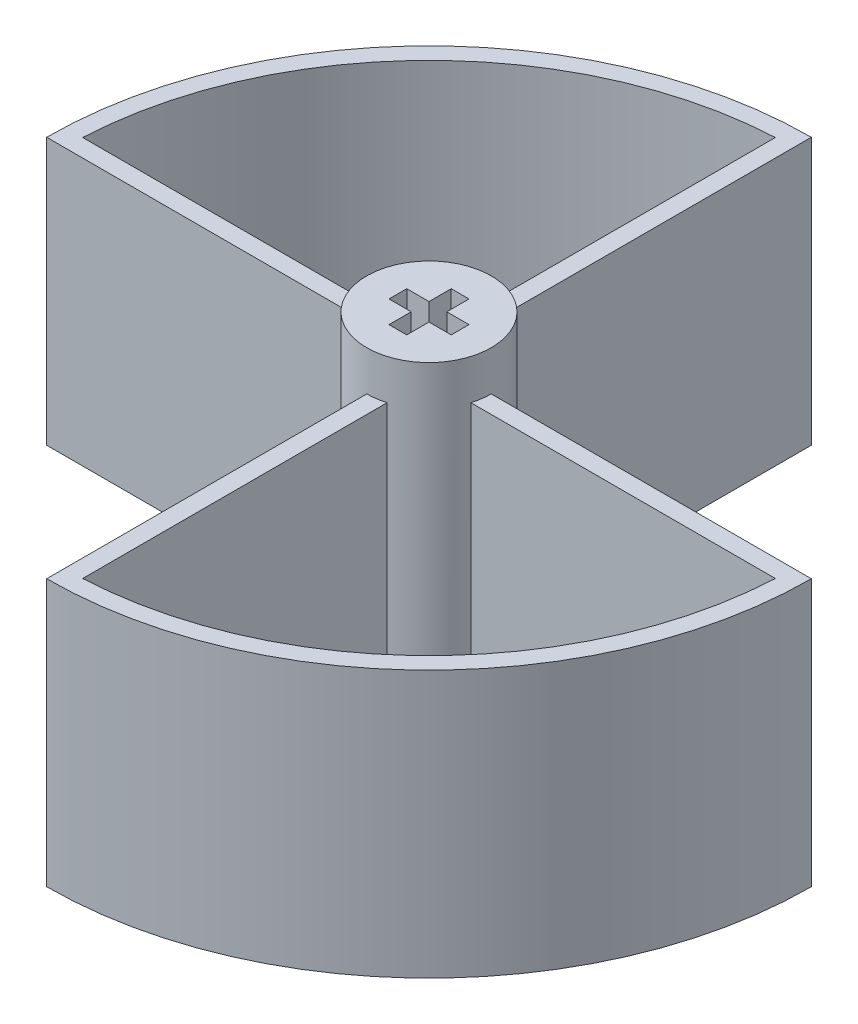
ISO-10303-21;
HEADER;
FILE_DESCRIPTION(('STEP AP214'),'2;1');
FILE_NAME('part.step','',(''),(''),'','','');
FILE_SCHEMA(('AUTOMOTIVE_DESIGN { 1 0 10303 214 1 1 1 1 }'));
ENDSEC;
DATA;
#1=APPLICATION_CONTEXT('core data for automotive mechanical design processes');
#2=APPLICATION_PROTOCOL_DEFINITION('international standard','automotive_design',2000,#1);
#3=PRODUCT_CONTEXT('',#1,'mechanical');
#4=PRODUCT('Part','Part','',(#3));
#5=PRODUCT_RELATED_PRODUCT_CATEGORY('part','',(#4));
#6=PRODUCT_DEFINITION_FORMATION('','',#4);
#7=PRODUCT_DEFINITION_CONTEXT('part definition',#1,'design');
#8=PRODUCT_DEFINITION('design','',#6,#7);
#9=PRODUCT_DEFINITION_SHAPE('','',#8);
#10=(LENGTH_UNIT() NAMED_UNIT(*) SI_UNIT(.MILLI.,.METRE.));
#11=(NAMED_UNIT(*) PLANE_ANGLE_UNIT() SI_UNIT($,.RADIAN.));
#12=(NAMED_UNIT(*) SI_UNIT($,.STERADIAN.) SOLID_ANGLE_UNIT());
#13=UNCERTAINTY_MEASURE_WITH_UNIT(LENGTH_MEASURE(1.E-05),#10,'distance_accuracy_value','');
#14=(GEOMETRIC_REPRESENTATION_CONTEXT(3) GLOBAL_UNCERTAINTY_ASSIGNED_CONTEXT((#13)) GLOBAL_UNIT_ASSIGNED_CONTEXT((#10,
#11,#12)) REPRESENTATION_CONTEXT('',''));
#15=CARTESIAN_POINT('',(0.,0.,0.));
#16=DIRECTION('',(0.,0.,1.));
#17=DIRECTION('',(1.,0.,0.));
#18=AXIS2_PLACEMENT_3D('',#15,#16,#17);
#19=CARTESIAN_POINT('',(0.,-4.5,0.));
#20=DIRECTION('',(0.,1.,0.));
#21=DIRECTION('',(0.,0.,1.));
#22=AXIS2_PLACEMENT_3D('',#19,#20,#21);
#23=PLANE('',#22);
#24=DIRECTION('',(-1.,0.,0.));
#25=VECTOR('',#24,1.);
#26=CARTESIAN_POINT('',(-3.5,-4.5,-1.));
#27=LINE('',#26,#25);
#28=CARTESIAN_POINT('',(-1.,-4.5,-1.));
#29=VERTEX_POINT('',#28);
#30=CARTESIAN_POINT('',(-3.5,-4.5,-1.));
#31=VERTEX_POINT('',#30);
#32=EDGE_CURVE('E339',#29,#31,#27,.T.);
#33=ORIENTED_EDGE('',*,*,#32,.T.);
#34=DIRECTION('',(0.,0.,1.));
#35=VECTOR('',#34,1.);
#36=CARTESIAN_POINT('',(-3.5,-4.5,1.));
#37=LINE('',#36,#35);
#38=CARTESIAN_POINT('',(-3.5,-4.5,1.));
#39=VERTEX_POINT('',#38);
#40=EDGE_CURVE('E298',#31,#39,#37,.T.);
#41=ORIENTED_EDGE('',*,*,#40,.T.);
#42=DIRECTION('',(1.,0.,0.));
#43=VECTOR('',#42,1.);
#44=CARTESIAN_POINT('',(-1.,-4.5,1.));
#45=LINE('',#44,#43);
#46=CARTESIAN_POINT('',(-1.,-4.5,1.));
#47=VERTEX_POINT('',#46);
#48=EDGE_CURVE('E234',#39,#47,#45,.T.);
#49=ORIENTED_EDGE('',*,*,#48,.T.);
#50=DIRECTION('',(0.,0.,1.));
#51=VECTOR('',#50,1.);
#52=CARTESIAN_POINT('',(-1.,-4.5,3.5));
#53=LINE('',#52,#51);
#54=CARTESIAN_POINT('',(-1.,-4.5,3.5));
#55=VERTEX_POINT('',#54);
#56=EDGE_CURVE('E303',#47,#55,#53,.T.);
#57=ORIENTED_EDGE('',*,*,#56,.T.);
#58=DIRECTION('',(1.,0.,0.));
#59=VECTOR('',#58,1.);
#60=CARTESIAN_POINT('',(1.,-4.5,3.5));
#61=LINE('',#60,#59);
#62=CARTESIAN_POINT('',(1.,-4.5,3.5));
#63=VERTEX_POINT('',#62);
#64=EDGE_CURVE('E307',#55,#63,#61,.T.);
#65=ORIENTED_EDGE('',*,*,#64,.T.);
#66=DIRECTION('',(0.,0.,-1.));
#67=VECTOR('',#66,1.);
#68=CARTESIAN_POINT('',(1.,-4.5,1.));
#69=LINE('',#68,#67);
#70=CARTESIAN_POINT('',(1.,-4.5,1.));
#71=VERTEX_POINT('',#70);
#72=EDGE_CURVE('E311',#63,#71,#69,.T.);
#73=ORIENTED_EDGE('',*,*,#72,.T.);
#74=DIRECTION('',(1.,0.,0.));
#75=VECTOR('',#74,1.);
#76=CARTESIAN_POINT('',(3.5,-4.5,1.));
#77=LINE('',#76,#75);
#78=CARTESIAN_POINT('',(3.5,-4.5,1.));
#79=VERTEX_POINT('',#78);
#80=EDGE_CURVE('E315',#71,#79,#77,.T.);
#81=ORIENTED_EDGE('',*,*,#80,.T.);
#82=DIRECTION('',(0.,0.,-1.));
#83=VECTOR('',#82,1.);
#84=CARTESIAN_POINT('',(3.5,-4.5,-1.));
#85=LINE('',#84,#83);
#86=CARTESIAN_POINT('',(3.5,-4.5,-1.));
#87=VERTEX_POINT('',#86);
#88=EDGE_CURVE('E319',#79,#87,#85,.T.);
#89=ORIENTED_EDGE('',*,*,#88,.T.);
#90=DIRECTION('',(-1.,0.,0.));
#91=VECTOR('',#90,1.);
#92=CARTESIAN_POINT('',(1.,-4.5,-1.));
#93=LINE('',#92,#91);
#94=CARTESIAN_POINT('',(1.,-4.5,-1.));
#95=VERTEX_POINT('',#94);
#96=EDGE_CURVE('E323',#87,#95,#93,.T.);
#97=ORIENTED_EDGE('',*,*,#96,.T.);
#98=DIRECTION('',(0.,0.,-1.));
#99=VECTOR('',#98,1.);
#100=CARTESIAN_POINT('',(0.999999999999999,-4.5,-3.5));
#101=LINE('',#100,#99);
#102=CARTESIAN_POINT('',(0.999999999999999,-4.5,-3.5));
#103=VERTEX_POINT('',#102);
#104=EDGE_CURVE('E327',#95,#103,#101,.T.);
#105=ORIENTED_EDGE('',*,*,#104,.T.);
#106=DIRECTION('',(-1.,0.,0.));
#107=VECTOR('',#106,1.);
#108=CARTESIAN_POINT('',(-1.,-4.5,-3.5));
#109=LINE('',#108,#107);
#110=CARTESIAN_POINT('',(-1.,-4.5,-3.5));
#111=VERTEX_POINT('',#110);
#112=EDGE_CURVE('E331',#103,#111,#109,.T.);
#113=ORIENTED_EDGE('',*,*,#112,.T.);
#114=DIRECTION('',(0.,0.,1.));
#115=VECTOR('',#114,1.);
#116=CARTESIAN_POINT('',(-1.,-4.5,-1.));
#117=LINE('',#116,#115);
#118=EDGE_CURVE('E335',#111,#29,#117,.T.);
#119=ORIENTED_EDGE('',*,*,#118,.T.);
#120=EDGE_LOOP('',(#33,#41,#49,#57,#65,#73,#81,#89,#97,#105,#113,#119));
#121=FACE_BOUND('',#120,.T.);
#122=CARTESIAN_POINT('',(0.,-4.5,0.));
#123=DIRECTION('',(0.,1.,0.));
#124=DIRECTION('',(0.,0.,1.));
#125=AXIS2_PLACEMENT_3D('',#122,#123,#124);
#126=CIRCLE('',#125,7.);
#127=CARTESIAN_POINT('',(0.,-4.5,7.));
#128=VERTEX_POINT('',#127);
#129=EDGE_CURVE('E343',#128,#128,#126,.T.);
#130=ORIENTED_EDGE('',*,*,#129,.F.);
#131=EDGE_LOOP('',(#130));
#132=FACE_BOUND('',#131,.T.);
#133=ADVANCED_FACE('F39',(#121,#132),#23,.F.);
#134=CARTESIAN_POINT('',(0.,30.,0.));
#135=DIRECTION('',(0.,-1.,0.));
#136=DIRECTION('',(0.,0.,-1.));
#137=AXIS2_PLACEMENT_3D('',#134,#135,#136);
#138=CYLINDRICAL_SURFACE('',#137,43.);
#139=CARTESIAN_POINT('',(0.,0.,0.));
#140=DIRECTION('',(0.,1.,0.));
#141=DIRECTION('',(0.,0.,1.));
#142=AXIS2_PLACEMENT_3D('',#139,#140,#141);
#143=CIRCLE('',#142,43.);
#144=CARTESIAN_POINT('',(4.50401092710764E-13,0.,43.));
#145=VERTEX_POINT('',#144);
#146=CARTESIAN_POINT('',(43.,0.,0.));
#147=VERTEX_POINT('',#146);
#148=EDGE_CURVE('E436',#145,#147,#143,.T.);
#149=ORIENTED_EDGE('',*,*,#148,.T.);
#150=DIRECTION('',(0.,-1.,0.));
#151=VECTOR('',#150,1.);
#152=CARTESIAN_POINT('',(43.,30.,0.));
#153=LINE('',#152,#151);
#154=CARTESIAN_POINT('',(43.,30.,0.));
#155=VERTEX_POINT('',#154);
#156=EDGE_CURVE('E48',#155,#147,#153,.T.);
#157=ORIENTED_EDGE('',*,*,#156,.F.);
#158=CARTESIAN_POINT('',(0.,30.,0.));
#159=DIRECTION('',(0.,1.,0.));
#160=DIRECTION('',(0.,0.,1.));
#161=AXIS2_PLACEMENT_3D('',#158,#159,#160);
#162=CIRCLE('',#161,43.);
#163=CARTESIAN_POINT('',(4.50401092710764E-13,30.,43.));
#164=VERTEX_POINT('',#163);
#165=EDGE_CURVE('E464',#164,#155,#162,.T.);
#166=ORIENTED_EDGE('',*,*,#165,.F.);
#167=DIRECTION('',(0.,-1.,0.));
#168=VECTOR('',#167,1.);
#169=CARTESIAN_POINT('',(4.50401092710764E-13,30.,43.));
#170=LINE('',#169,#168);
#171=EDGE_CURVE('E484',#164,#145,#170,.T.);
#172=ORIENTED_EDGE('',*,*,#171,.T.);
#173=EDGE_LOOP('',(#149,#157,#166,#172));
#174=FACE_BOUND('',#173,.T.);
#175=ADVANCED_FACE('F41',(#174),#138,.T.);
#176=CARTESIAN_POINT('',(7.,30.,0.));
#177=DIRECTION('',(0.,0.,1.));
#178=DIRECTION('',(1.,0.,0.));
#179=AXIS2_PLACEMENT_3D('',#176,#177,#178);
#180=PLANE('',#179);
#181=DIRECTION('',(-1.,0.,0.));
#182=VECTOR('',#181,1.);
#183=CARTESIAN_POINT('',(7.,0.,0.));
#184=LINE('',#183,#182);
#185=CARTESIAN_POINT('',(7.,0.,0.));
#186=VERTEX_POINT('',#185);
#187=EDGE_CURVE('E488',#147,#186,#184,.T.);
#188=ORIENTED_EDGE('',*,*,#187,.T.);
#189=DIRECTION('',(0.,-1.,0.));
#190=VECTOR('',#189,1.);
#191=CARTESIAN_POINT('',(7.,30.,0.));
#192=LINE('',#191,#190);
#193=CARTESIAN_POINT('',(7.,30.,0.));
#194=VERTEX_POINT('',#193);
#195=EDGE_CURVE('E527',#194,#186,#192,.T.);
#196=ORIENTED_EDGE('',*,*,#195,.F.);
#197=DIRECTION('',(-1.,0.,0.));
#198=VECTOR('',#197,1.);
#199=CARTESIAN_POINT('',(7.,30.,0.));
#200=LINE('',#199,#198);
#201=EDGE_CURVE('E468',#155,#194,#200,.T.);
#202=ORIENTED_EDGE('',*,*,#201,.F.);
#203=ORIENTED_EDGE('',*,*,#156,.T.);
#204=EDGE_LOOP('',(#188,#196,#202,#203));
#205=FACE_BOUND('',#204,.T.);
#206=ADVANCED_FACE('F534',(#205),#180,.F.);
#207=CARTESIAN_POINT('',(0.,30.,0.));
#208=DIRECTION('',(0.,-1.,0.));
#209=DIRECTION('',(0.,0.,-1.));
#210=AXIS2_PLACEMENT_3D('',#207,#208,#209);
#211=CYLINDRICAL_SURFACE('',#210,43.);
#212=CARTESIAN_POINT('',(0.,0.,0.));
#213=DIRECTION('',(0.,1.,0.));
#214=DIRECTION('',(0.,0.,1.));
#215=AXIS2_PLACEMENT_3D('',#212,#213,#214);
#216=CIRCLE('',#215,43.);
#217=CARTESIAN_POINT('',(0.,0.,-43.));
#218=VERTEX_POINT('',#217);
#219=CARTESIAN_POINT('',(-43.,0.,3.00267395140509E-13));
#220=VERTEX_POINT('',#219);
#221=EDGE_CURVE('E495',#218,#220,#216,.T.);
#222=ORIENTED_EDGE('',*,*,#221,.T.);
#223=DIRECTION('',(0.,-1.,0.));
#224=VECTOR('',#223,1.);
#225=CARTESIAN_POINT('',(-43.,30.,3.00267395140509E-13));
#226=LINE('',#225,#224);
#227=CARTESIAN_POINT('',(-43.,30.,3.00267395140509E-13));
#228=VERTEX_POINT('',#227);
#229=EDGE_CURVE('E515',#228,#220,#226,.T.);
#230=ORIENTED_EDGE('',*,*,#229,.F.);
#231=CARTESIAN_POINT('',(0.,30.,0.));
#232=DIRECTION('',(0.,1.,0.));
#233=DIRECTION('',(0.,0.,1.));
#234=AXIS2_PLACEMENT_3D('',#231,#232,#233);
#235=CIRCLE('',#234,43.);
#236=CARTESIAN_POINT('',(0.,30.,-43.));
#237=VERTEX_POINT('',#236);
#238=EDGE_CURVE('E475',#237,#228,#235,.T.);
#239=ORIENTED_EDGE('',*,*,#238,.F.);
#240=DIRECTION('',(0.,-1.,0.));
#241=VECTOR('',#240,1.);
#242=CARTESIAN_POINT('',(0.,30.,-43.));
#243=LINE('',#242,#241);
#244=EDGE_CURVE('E519',#237,#218,#243,.T.);
#245=ORIENTED_EDGE('',*,*,#244,.T.);
#246=EDGE_LOOP('',(#222,#230,#239,#245));
#247=FACE_BOUND('',#246,.T.);
#248=ADVANCED_FACE('F627',(#247),#211,.T.);
#249=CARTESIAN_POINT('',(0.,30.,-7.));
#250=DIRECTION('',(-1.,0.,0.));
#251=DIRECTION('',(0.,0.,1.));
#252=AXIS2_PLACEMENT_3D('',#249,#250,#251);
#253=PLANE('',#252);
#254=DIRECTION('',(0.,0.,-1.));
#255=VECTOR('',#254,1.);
#256=CARTESIAN_POINT('',(0.,0.,-7.));
#257=LINE('',#256,#255);
#258=CARTESIAN_POINT('',(0.,0.,-7.));
#259=VERTEX_POINT('',#258);
#260=EDGE_CURVE('E492',#259,#218,#257,.T.);
#261=ORIENTED_EDGE('',*,*,#260,.T.);
#262=ORIENTED_EDGE('',*,*,#244,.F.);
#263=DIRECTION('',(0.,0.,-1.));
#264=VECTOR('',#263,1.);
#265=CARTESIAN_POINT('',(0.,30.,-7.));
#266=LINE('',#265,#264);
#267=CARTESIAN_POINT('',(0.,30.,-7.));
#268=VERTEX_POINT('',#267);
#269=EDGE_CURVE('E472',#268,#237,#266,.T.);
#270=ORIENTED_EDGE('',*,*,#269,.F.);
#271=DIRECTION('',(0.,-1.,0.));
#272=VECTOR('',#271,1.);
#273=CARTESIAN_POINT('',(0.,30.,-7.));
#274=LINE('',#273,#272);
#275=EDGE_CURVE('E523',#268,#259,#274,.T.);
#276=ORIENTED_EDGE('',*,*,#275,.T.);
#277=EDGE_LOOP('',(#261,#262,#270,#276));
#278=FACE_BOUND('',#277,.T.);
#279=ADVANCED_FACE('F597',(#278),#253,.F.);
#280=CARTESIAN_POINT('',(0.,30.,0.));
#281=DIRECTION('',(0.,-1.,0.));
#282=DIRECTION('',(0.,0.,-1.));
#283=AXIS2_PLACEMENT_3D('',#280,#281,#282);
#284=CYLINDRICAL_SURFACE('',#283,41.);
#285=CARTESIAN_POINT('',(0.,2.,0.));
#286=DIRECTION('',(0.,1.,0.));
#287=DIRECTION('',(0.,0.,1.));
#288=AXIS2_PLACEMENT_3D('',#285,#286,#287);
#289=CIRCLE('',#288,41.);
#290=CARTESIAN_POINT('',(-2.,2.,-40.9511904588865));
#291=VERTEX_POINT('',#290);
#292=CARTESIAN_POINT('',(-40.9511904588865,2.,-1.99999999999972));
#293=VERTEX_POINT('',#292);
#294=EDGE_CURVE('E398',#291,#293,#289,.T.);
#295=ORIENTED_EDGE('',*,*,#294,.F.);
#296=DIRECTION('',(0.,-1.,0.));
#297=VECTOR('',#296,1.);
#298=CARTESIAN_POINT('',(-2.,30.,-40.9511904588865));
#299=LINE('',#298,#297);
#300=CARTESIAN_POINT('',(-2.,30.,-40.9511904588865));
#301=VERTEX_POINT('',#300);
#302=EDGE_CURVE('E385',#301,#291,#299,.T.);
#303=ORIENTED_EDGE('',*,*,#302,.F.);
#304=CARTESIAN_POINT('',(0.,30.,0.));
#305=DIRECTION('',(0.,1.,0.));
#306=DIRECTION('',(0.,0.,1.));
#307=AXIS2_PLACEMENT_3D('',#304,#305,#306);
#308=CIRCLE('',#307,41.);
#309=CARTESIAN_POINT('',(-40.9511904588865,30.,-1.99999999999972));
#310=VERTEX_POINT('',#309);
#311=EDGE_CURVE('E424',#301,#310,#308,.T.);
#312=ORIENTED_EDGE('',*,*,#311,.T.);
#313=DIRECTION('',(0.,-1.,0.));
#314=VECTOR('',#313,1.);
#315=CARTESIAN_POINT('',(-40.9511904588865,30.,-1.99999999999972));
#316=LINE('',#315,#314);
#317=EDGE_CURVE('E390',#310,#293,#316,.T.);
#318=ORIENTED_EDGE('',*,*,#317,.T.);
#319=EDGE_LOOP('',(#295,#303,#312,#318));
#320=FACE_BOUND('',#319,.T.);
#321=ADVANCED_FACE('F595',(#320),#284,.F.);
#322=CARTESIAN_POINT('',(-7.00000000000002,30.,-2.));
#323=DIRECTION('',(0.,0.,-1.));
#324=DIRECTION('',(-1.,0.,0.));
#325=AXIS2_PLACEMENT_3D('',#322,#323,#324);
#326=PLANE('',#325);
#327=DIRECTION('',(0.,1.,0.));
#328=VECTOR('',#327,1.);
#329=CARTESIAN_POINT('',(-6.70820393249937,-4.5,-2.));
#330=LINE('',#329,#328);
#331=CARTESIAN_POINT('',(-6.70820393249937,2.,-2.));
#332=VERTEX_POINT('',#331);
#333=CARTESIAN_POINT('',(-6.70820393249937,30.,-2.));
#334=VERTEX_POINT('',#333);
#335=EDGE_CURVE('E356',#332,#334,#330,.T.);
#336=ORIENTED_EDGE('',*,*,#335,.F.);
#337=DIRECTION('',(1.,0.,0.));
#338=VECTOR('',#337,1.);
#339=CARTESIAN_POINT('',(-7.00000000000002,2.,-2.));
#340=LINE('',#339,#338);
#341=EDGE_CURVE('E405',#293,#332,#340,.T.);
#342=ORIENTED_EDGE('',*,*,#341,.F.);
#343=ORIENTED_EDGE('',*,*,#317,.F.);
#344=DIRECTION('',(1.,0.,0.));
#345=VECTOR('',#344,1.);
#346=CARTESIAN_POINT('',(-7.00000000000002,30.,-2.));
#347=LINE('',#346,#345);
#348=EDGE_CURVE('E427',#310,#334,#347,.T.);
#349=ORIENTED_EDGE('',*,*,#348,.T.);
#350=EDGE_LOOP('',(#336,#342,#343,#349));
#351=FACE_BOUND('',#350,.T.);
#352=ADVANCED_FACE('F593',(#351),#326,.T.);
#353=CARTESIAN_POINT('',(-2.,30.,-7.));
#354=DIRECTION('',(-1.,0.,0.));
#355=DIRECTION('',(0.,0.,1.));
#356=AXIS2_PLACEMENT_3D('',#353,#354,#355);
#357=PLANE('',#356);
#358=DIRECTION('',(0.,1.,0.));
#359=VECTOR('',#358,1.);
#360=CARTESIAN_POINT('',(-2.,-4.5,-6.70820393249937));
#361=LINE('',#360,#359);
#362=CARTESIAN_POINT('',(-2.,30.,-6.70820393249937));
#363=VERTEX_POINT('',#362);
#364=CARTESIAN_POINT('',(-2.,2.,-6.70820393249937));
#365=VERTEX_POINT('',#364);
#366=EDGE_CURVE('E11',#363,#365,#361,.F.);
#367=ORIENTED_EDGE('',*,*,#366,.F.);
#368=DIRECTION('',(0.,0.,-1.));
#369=VECTOR('',#368,1.);
#370=CARTESIAN_POINT('',(-2.,30.,-7.));
#371=LINE('',#370,#369);
#372=EDGE_CURVE('E421',#363,#301,#371,.T.);
#373=ORIENTED_EDGE('',*,*,#372,.T.);
#374=ORIENTED_EDGE('',*,*,#302,.T.);
#375=DIRECTION('',(0.,0.,-1.));
#376=VECTOR('',#375,1.);
#377=CARTESIAN_POINT('',(-2.,2.,-7.));
#378=LINE('',#377,#376);
#379=EDGE_CURVE('E395',#365,#291,#378,.T.);
#380=ORIENTED_EDGE('',*,*,#379,.F.);
#381=EDGE_LOOP('',(#367,#373,#374,#380));
#382=FACE_BOUND('',#381,.T.);
#383=ADVANCED_FACE('F589',(#382),#357,.T.);
#384=CARTESIAN_POINT('',(0.,2.,0.));
#385=DIRECTION('',(0.,1.,0.));
#386=DIRECTION('',(0.,0.,1.));
#387=AXIS2_PLACEMENT_3D('',#384,#385,#386);
#388=PLANE('',#387);
#389=CARTESIAN_POINT('',(0.,2.,0.));
#390=DIRECTION('',(0.,1.,0.));
#391=DIRECTION('',(0.,0.,1.));
#392=AXIS2_PLACEMENT_3D('',#389,#390,#391);
#393=CIRCLE('',#392,7.);
#394=EDGE_CURVE('E347',#365,#332,#393,.T.);
#395=ORIENTED_EDGE('',*,*,#394,.F.);
#396=ORIENTED_EDGE('',*,*,#379,.T.);
#397=ORIENTED_EDGE('',*,*,#294,.T.);
#398=ORIENTED_EDGE('',*,*,#341,.T.);
#399=EDGE_LOOP('',(#395,#396,#397,#398));
#400=FACE_BOUND('',#399,.T.);
#401=ADVANCED_FACE('F592',(#400),#388,.T.);
#402=CARTESIAN_POINT('',(0.,30.,0.));
#403=DIRECTION('',(0.,1.,0.));
#404=DIRECTION('',(0.,0.,1.));
#405=AXIS2_PLACEMENT_3D('',#402,#403,#404);
#406=PLANE('',#405);
#407=CARTESIAN_POINT('',(0.,30.,0.));
#408=DIRECTION('',(0.,1.,0.));
#409=DIRECTION('',(0.,0.,1.));
#410=AXIS2_PLACEMENT_3D('',#407,#408,#409);
#411=CIRCLE('',#410,7.);
#412=EDGE_CURVE('E351',#268,#363,#411,.T.);
#413=ORIENTED_EDGE('',*,*,#412,.F.);
#414=ORIENTED_EDGE('',*,*,#269,.T.);
#415=ORIENTED_EDGE('',*,*,#238,.T.);
#416=DIRECTION('',(1.,0.,0.));
#417=VECTOR('',#416,1.);
#418=CARTESIAN_POINT('',(-7.,30.,0.));
#419=LINE('',#418,#417);
#420=CARTESIAN_POINT('',(-7.,30.,0.));
#421=VERTEX_POINT('',#420);
#422=EDGE_CURVE('E478',#228,#421,#419,.T.);
#423=ORIENTED_EDGE('',*,*,#422,.T.);
#424=EDGE_CURVE('E364',#334,#421,#411,.T.);
#425=ORIENTED_EDGE('',*,*,#424,.F.);
#426=ORIENTED_EDGE('',*,*,#348,.F.);
#427=ORIENTED_EDGE('',*,*,#311,.F.);
#428=ORIENTED_EDGE('',*,*,#372,.F.);
#429=EDGE_LOOP('',(#413,#414,#415,#423,#425,#426,#427,#428));
#430=FACE_BOUND('',#429,.T.);
#431=ADVANCED_FACE('F573',(#430),#406,.T.);
#432=CARTESIAN_POINT('',(0.,0.,0.));
#433=DIRECTION('',(0.,1.,0.));
#434=DIRECTION('',(0.,0.,1.));
#435=AXIS2_PLACEMENT_3D('',#432,#433,#434);
#436=PLANE('',#435);
#437=ORIENTED_EDGE('',*,*,#260,.F.);
#438=CARTESIAN_POINT('',(0.,0.,0.));
#439=DIRECTION('',(0.,1.,0.));
#440=DIRECTION('',(0.,0.,1.));
#441=AXIS2_PLACEMENT_3D('',#438,#439,#440);
#442=CIRCLE('',#441,7.);
#443=CARTESIAN_POINT('',(-7.,0.,0.));
#444=VERTEX_POINT('',#443);
#445=EDGE_CURVE('E371',#259,#444,#442,.T.);
#446=ORIENTED_EDGE('',*,*,#445,.T.);
#447=DIRECTION('',(1.,0.,0.));
#448=VECTOR('',#447,1.);
#449=CARTESIAN_POINT('',(-7.,0.,0.));
#450=LINE('',#449,#448);
#451=EDGE_CURVE('E498',#220,#444,#450,.T.);
#452=ORIENTED_EDGE('',*,*,#451,.F.);
#453=ORIENTED_EDGE('',*,*,#221,.F.);
#454=EDGE_LOOP('',(#437,#446,#452,#453));
#455=FACE_BOUND('',#454,.T.);
#456=ADVANCED_FACE('F625',(#455),#436,.F.);
#457=CARTESIAN_POINT('',(-7.,30.,0.));
#458=DIRECTION('',(0.,0.,-1.));
#459=DIRECTION('',(-1.,0.,0.));
#460=AXIS2_PLACEMENT_3D('',#457,#458,#459);
#461=PLANE('',#460);
#462=ORIENTED_EDGE('',*,*,#451,.T.);
#463=DIRECTION('',(0.,-1.,0.));
#464=VECTOR('',#463,1.);
#465=CARTESIAN_POINT('',(-7.,30.,0.));
#466=LINE('',#465,#464);
#467=EDGE_CURVE('E511',#421,#444,#466,.T.);
#468=ORIENTED_EDGE('',*,*,#467,.F.);
#469=ORIENTED_EDGE('',*,*,#422,.F.);
#470=ORIENTED_EDGE('',*,*,#229,.T.);
#471=EDGE_LOOP('',(#462,#468,#469,#470));
#472=FACE_BOUND('',#471,.T.);
#473=ADVANCED_FACE('F587',(#472),#461,.F.);
#474=CARTESIAN_POINT('',(0.,30.,0.));
#475=DIRECTION('',(0.,-1.,0.));
#476=DIRECTION('',(0.,0.,-1.));
#477=AXIS2_PLACEMENT_3D('',#474,#475,#476);
#478=CYLINDRICAL_SURFACE('',#477,41.);
#479=CARTESIAN_POINT('',(0.,2.,0.));
#480=DIRECTION('',(0.,1.,0.));
#481=DIRECTION('',(0.,0.,1.));
#482=AXIS2_PLACEMENT_3D('',#479,#480,#481);
#483=CIRCLE('',#482,41.);
#484=CARTESIAN_POINT('',(2.00000000000042,2.,40.9511904588865));
#485=VERTEX_POINT('',#484);
#486=CARTESIAN_POINT('',(40.9511904588865,2.,2.));
#487=VERTEX_POINT('',#486);
#488=EDGE_CURVE('E374',#485,#487,#483,.T.);
#489=ORIENTED_EDGE('',*,*,#488,.F.);
#490=DIRECTION('',(0.,-1.,0.));
#491=VECTOR('',#490,1.);
#492=CARTESIAN_POINT('',(2.00000000000042,30.,40.9511904588865));
#493=LINE('',#492,#491);
#494=CARTESIAN_POINT('',(2.00000000000042,30.,40.9511904588865));
#495=VERTEX_POINT('',#494);
#496=EDGE_CURVE('E386',#495,#485,#493,.T.);
#497=ORIENTED_EDGE('',*,*,#496,.F.);
#498=CARTESIAN_POINT('',(0.,30.,0.));
#499=DIRECTION('',(0.,1.,0.));
#500=DIRECTION('',(0.,0.,1.));
#501=AXIS2_PLACEMENT_3D('',#498,#499,#500);
#502=CIRCLE('',#501,41.);
#503=CARTESIAN_POINT('',(40.9511904588865,30.,2.));
#504=VERTEX_POINT('',#503);
#505=EDGE_CURVE('E415',#495,#504,#502,.T.);
#506=ORIENTED_EDGE('',*,*,#505,.T.);
#507=DIRECTION('',(0.,-1.,0.));
#508=VECTOR('',#507,1.);
#509=CARTESIAN_POINT('',(40.9511904588865,30.,2.));
#510=LINE('',#509,#508);
#511=EDGE_CURVE('E380',#504,#487,#510,.T.);
#512=ORIENTED_EDGE('',*,*,#511,.T.);
#513=EDGE_LOOP('',(#489,#497,#506,#512));
#514=FACE_BOUND('',#513,.T.);
#515=ADVANCED_FACE('F562',(#514),#478,.F.);
#516=CARTESIAN_POINT('',(0.,2.,0.));
#517=DIRECTION('',(0.,1.,0.));
#518=DIRECTION('',(0.,0.,1.));
#519=AXIS2_PLACEMENT_3D('',#516,#517,#518);
#520=CIRCLE('',#519,7.);
#521=CARTESIAN_POINT('',(2.,2.,6.70820393249937));
#522=VERTEX_POINT('',#521);
#523=CARTESIAN_POINT('',(6.70820393249937,2.,2.));
#524=VERTEX_POINT('',#523);
#525=EDGE_CURVE('E365',#522,#524,#520,.T.);
#526=ORIENTED_EDGE('',*,*,#525,.F.);
#527=DIRECTION('',(0.,0.,1.));
#528=VECTOR('',#527,1.);
#529=CARTESIAN_POINT('',(2.,2.,6.99999999999998));
#530=LINE('',#529,#528);
#531=EDGE_CURVE('E412',#522,#485,#530,.T.);
#532=ORIENTED_EDGE('',*,*,#531,.T.);
#533=ORIENTED_EDGE('',*,*,#488,.T.);
#534=DIRECTION('',(-1.,0.,0.));
#535=VECTOR('',#534,1.);
#536=CARTESIAN_POINT('',(7.,2.,2.));
#537=LINE('',#536,#535);
#538=EDGE_CURVE('E379',#487,#524,#537,.T.);
#539=ORIENTED_EDGE('',*,*,#538,.T.);
#540=EDGE_LOOP('',(#526,#532,#533,#539));
#541=FACE_BOUND('',#540,.T.);
#542=ADVANCED_FACE('F558',(#541),#388,.T.);
#543=CARTESIAN_POINT('',(7.,30.,2.));
#544=DIRECTION('',(0.,0.,1.));
#545=DIRECTION('',(1.,0.,0.));
#546=AXIS2_PLACEMENT_3D('',#543,#544,#545);
#547=PLANE('',#546);
#548=DIRECTION('',(0.,1.,0.));
#549=VECTOR('',#548,1.);
#550=CARTESIAN_POINT('',(6.70820393249937,-4.5,2.));
#551=LINE('',#550,#549);
#552=CARTESIAN_POINT('',(6.70820393249937,30.,2.));
#553=VERTEX_POINT('',#552);
#554=EDGE_CURVE('E360',#524,#553,#551,.T.);
#555=ORIENTED_EDGE('',*,*,#554,.F.);
#556=ORIENTED_EDGE('',*,*,#538,.F.);
#557=ORIENTED_EDGE('',*,*,#511,.F.);
#558=DIRECTION('',(-1.,0.,0.));
#559=VECTOR('',#558,1.);
#560=CARTESIAN_POINT('',(7.,30.,2.));
#561=LINE('',#560,#559);
#562=EDGE_CURVE('E418',#504,#553,#561,.T.);
#563=ORIENTED_EDGE('',*,*,#562,.T.);
#564=EDGE_LOOP('',(#555,#556,#557,#563));
#565=FACE_BOUND('',#564,.T.);
#566=ADVANCED_FACE('F555',(#565),#547,.T.);
#567=CARTESIAN_POINT('',(2.,30.,6.99999999999998));
#568=DIRECTION('',(1.,0.,0.));
#569=DIRECTION('',(0.,0.,-1.));
#570=AXIS2_PLACEMENT_3D('',#567,#568,#569);
#571=PLANE('',#570);
#572=DIRECTION('',(0.,1.,0.));
#573=VECTOR('',#572,1.);
#574=CARTESIAN_POINT('',(2.,-4.5,6.70820393249937));
#575=LINE('',#574,#573);
#576=CARTESIAN_POINT('',(2.,30.,6.70820393249937));
#577=VERTEX_POINT('',#576);
#578=EDGE_CURVE('E55',#577,#522,#575,.F.);
#579=ORIENTED_EDGE('',*,*,#578,.F.);
#580=DIRECTION('',(0.,0.,1.));
#581=VECTOR('',#580,1.);
#582=CARTESIAN_POINT('',(2.,30.,6.99999999999998));
#583=LINE('',#582,#581);
#584=EDGE_CURVE('E391',#577,#495,#583,.T.);
#585=ORIENTED_EDGE('',*,*,#584,.T.);
#586=ORIENTED_EDGE('',*,*,#496,.T.);
#587=ORIENTED_EDGE('',*,*,#531,.F.);
#588=EDGE_LOOP('',(#579,#585,#586,#587));
#589=FACE_BOUND('',#588,.T.);
#590=ADVANCED_FACE('F565',(#589),#571,.T.);
#591=CARTESIAN_POINT('',(0.,30.,7.));
#592=VERTEX_POINT('',#591);
#593=EDGE_CURVE('E355',#592,#577,#411,.T.);
#594=ORIENTED_EDGE('',*,*,#593,.F.);
#595=DIRECTION('',(0.,0.,1.));
#596=VECTOR('',#595,1.);
#597=CARTESIAN_POINT('',(0.,30.,7.));
#598=LINE('',#597,#596);
#599=EDGE_CURVE('E481',#592,#164,#598,.T.);
#600=ORIENTED_EDGE('',*,*,#599,.T.);
#601=ORIENTED_EDGE('',*,*,#165,.T.);
#602=ORIENTED_EDGE('',*,*,#201,.T.);
#603=EDGE_CURVE('E63',#553,#194,#411,.T.);
#604=ORIENTED_EDGE('',*,*,#603,.F.);
#605=ORIENTED_EDGE('',*,*,#562,.F.);
#606=ORIENTED_EDGE('',*,*,#505,.F.);
#607=ORIENTED_EDGE('',*,*,#584,.F.);
#608=EDGE_LOOP('',(#594,#600,#601,#602,#604,#605,#606,#607));
#609=FACE_BOUND('',#608,.T.);
#610=ADVANCED_FACE('F564',(#609),#406,.T.);
#611=DIRECTION('',(0.,0.,1.));
#612=VECTOR('',#611,1.);
#613=CARTESIAN_POINT('',(0.,0.,7.));
#614=LINE('',#613,#612);
#615=CARTESIAN_POINT('',(0.,0.,7.));
#616=VERTEX_POINT('',#615);
#617=EDGE_CURVE('E469',#616,#145,#614,.T.);
#618=ORIENTED_EDGE('',*,*,#617,.F.);
#619=EDGE_CURVE('E375',#616,#186,#442,.T.);
#620=ORIENTED_EDGE('',*,*,#619,.T.);
#621=ORIENTED_EDGE('',*,*,#187,.F.);
#622=ORIENTED_EDGE('',*,*,#148,.F.);
#623=EDGE_LOOP('',(#618,#620,#621,#622));
#624=FACE_BOUND('',#623,.T.);
#625=ADVANCED_FACE('F542',(#624),#436,.F.);
#626=CARTESIAN_POINT('',(0.,30.,7.));
#627=DIRECTION('',(1.,0.,0.));
#628=DIRECTION('',(0.,0.,-1.));
#629=AXIS2_PLACEMENT_3D('',#626,#627,#628);
#630=PLANE('',#629);
#631=ORIENTED_EDGE('',*,*,#617,.T.);
#632=ORIENTED_EDGE('',*,*,#171,.F.);
#633=ORIENTED_EDGE('',*,*,#599,.F.);
#634=DIRECTION('',(0.,-1.,0.));
#635=VECTOR('',#634,1.);
#636=CARTESIAN_POINT('',(0.,30.,7.));
#637=LINE('',#636,#635);
#638=EDGE_CURVE('E507',#592,#616,#637,.T.);
#639=ORIENTED_EDGE('',*,*,#638,.T.);
#640=EDGE_LOOP('',(#631,#632,#633,#639));
#641=FACE_BOUND('',#640,.T.);
#642=ADVANCED_FACE('F641',(#641),#630,.F.);
#643=CARTESIAN_POINT('',(0.,30.,0.));
#644=DIRECTION('',(0.,-1.,0.));
#645=DIRECTION('',(0.,0.,-1.));
#646=AXIS2_PLACEMENT_3D('',#643,#644,#645);
#647=CYLINDRICAL_SURFACE('',#646,7.);
#648=ORIENTED_EDGE('',*,*,#275,.F.);
#649=ORIENTED_EDGE('',*,*,#412,.T.);
#650=ORIENTED_EDGE('',*,*,#366,.T.);
#651=ORIENTED_EDGE('',*,*,#394,.T.);
#652=ORIENTED_EDGE('',*,*,#335,.T.);
#653=ORIENTED_EDGE('',*,*,#424,.T.);
#654=ORIENTED_EDGE('',*,*,#467,.T.);
#655=ORIENTED_EDGE('',*,*,#445,.F.);
#656=EDGE_LOOP('',(#648,#649,#650,#651,#652,#653,#654,#655));
#657=FACE_BOUND('',#656,.T.);
#658=ORIENTED_EDGE('',*,*,#603,.T.);
#659=ORIENTED_EDGE('',*,*,#195,.T.);
#660=ORIENTED_EDGE('',*,*,#619,.F.);
#661=ORIENTED_EDGE('',*,*,#638,.F.);
#662=ORIENTED_EDGE('',*,*,#593,.T.);
#663=ORIENTED_EDGE('',*,*,#578,.T.);
#664=ORIENTED_EDGE('',*,*,#525,.T.);
#665=ORIENTED_EDGE('',*,*,#554,.T.);
#666=EDGE_LOOP('',(#658,#659,#660,#661,#662,#663,#664,#665));
#667=FACE_BOUND('',#666,.T.);
#668=ORIENTED_EDGE('',*,*,#129,.T.);
#669=EDGE_LOOP('',(#668));
#670=FACE_BOUND('',#669,.T.);
#671=CARTESIAN_POINT('',(0.,34.5,0.));
#672=DIRECTION('',(0.,1.,0.));
#673=DIRECTION('',(0.,0.,1.));
#674=AXIS2_PLACEMENT_3D('',#671,#672,#673);
#675=CIRCLE('',#674,7.);
#676=CARTESIAN_POINT('',(0.,34.5,7.));
#677=VERTEX_POINT('',#676);
#678=EDGE_CURVE('E294',#677,#677,#675,.T.);
#679=ORIENTED_EDGE('',*,*,#678,.F.);
#680=EDGE_LOOP('',(#679));
#681=FACE_BOUND('',#680,.T.);
#682=ADVANCED_FACE('F552',(#657,#667,#670,#681),#647,.T.);
#683=CARTESIAN_POINT('',(-1.,0.,3.5));
#684=DIRECTION('',(0.,0.,1.));
#685=DIRECTION('',(1.,0.,0.));
#686=AXIS2_PLACEMENT_3D('',#683,#684,#685);
#687=PLANE('',#686);
#688=DIRECTION('',(0.,1.,0.));
#689=VECTOR('',#688,1.);
#690=CARTESIAN_POINT('',(-1.,0.,3.5));
#691=LINE('',#690,#689);
#692=CARTESIAN_POINT('',(-1.,34.5,3.5));
#693=VERTEX_POINT('',#692);
#694=EDGE_CURVE('E433',#55,#693,#691,.T.);
#695=ORIENTED_EDGE('',*,*,#694,.T.);
#696=DIRECTION('',(1.,0.,0.));
#697=VECTOR('',#696,1.);
#698=CARTESIAN_POINT('',(1.,34.5,3.5));
#699=LINE('',#698,#697);
#700=CARTESIAN_POINT('',(1.,34.5,3.5));
#701=VERTEX_POINT('',#700);
#702=EDGE_CURVE('E257',#693,#701,#699,.T.);
#703=ORIENTED_EDGE('',*,*,#702,.T.);
#704=DIRECTION('',(0.,1.,0.));
#705=VECTOR('',#704,1.);
#706=CARTESIAN_POINT('',(1.,0.,3.5));
#707=LINE('',#706,#705);
#708=EDGE_CURVE('E384',#63,#701,#707,.T.);
#709=ORIENTED_EDGE('',*,*,#708,.F.);
#710=ORIENTED_EDGE('',*,*,#64,.F.);
#711=EDGE_LOOP('',(#695,#703,#709,#710));
#712=FACE_BOUND('',#711,.T.);
#713=ADVANCED_FACE('F640',(#712),#687,.F.);
#714=CARTESIAN_POINT('',(-1.,0.,1.));
#715=DIRECTION('',(-1.,0.,0.));
#716=DIRECTION('',(0.,0.,1.));
#717=AXIS2_PLACEMENT_3D('',#714,#715,#716);
#718=PLANE('',#717);
#719=DIRECTION('',(0.,1.,0.));
#720=VECTOR('',#719,1.);
#721=CARTESIAN_POINT('',(-1.,0.,1.));
#722=LINE('',#721,#720);
#723=CARTESIAN_POINT('',(-1.,34.5,1.));
#724=VERTEX_POINT('',#723);
#725=EDGE_CURVE('E239',#47,#724,#722,.T.);
#726=ORIENTED_EDGE('',*,*,#725,.T.);
#727=DIRECTION('',(0.,0.,1.));
#728=VECTOR('',#727,1.);
#729=CARTESIAN_POINT('',(-1.,34.5,3.5));
#730=LINE('',#729,#728);
#731=EDGE_CURVE('E253',#724,#693,#730,.T.);
#732=ORIENTED_EDGE('',*,*,#731,.T.);
#733=ORIENTED_EDGE('',*,*,#694,.F.);
#734=ORIENTED_EDGE('',*,*,#56,.F.);
#735=EDGE_LOOP('',(#726,#732,#733,#734));
#736=FACE_BOUND('',#735,.T.);
#737=ADVANCED_FACE('F650',(#736),#718,.F.);
#738=CARTESIAN_POINT('',(-3.5,0.,1.));
#739=DIRECTION('',(0.,0.,1.));
#740=DIRECTION('',(1.,0.,0.));
#741=AXIS2_PLACEMENT_3D('',#738,#739,#740);
#742=PLANE('',#741);
#743=DIRECTION('',(0.,1.,0.));
#744=VECTOR('',#743,1.);
#745=CARTESIAN_POINT('',(-3.5,0.,1.));
#746=LINE('',#745,#744);
#747=CARTESIAN_POINT('',(-3.5,34.5,1.));
#748=VERTEX_POINT('',#747);
#749=EDGE_CURVE('E227',#39,#748,#746,.T.);
#750=ORIENTED_EDGE('',*,*,#749,.T.);
#751=DIRECTION('',(1.,0.,0.));
#752=VECTOR('',#751,1.);
#753=CARTESIAN_POINT('',(-1.,34.5,1.));
#754=LINE('',#753,#752);
#755=EDGE_CURVE('E231',#748,#724,#754,.T.);
#756=ORIENTED_EDGE('',*,*,#755,.T.);
#757=ORIENTED_EDGE('',*,*,#725,.F.);
#758=ORIENTED_EDGE('',*,*,#48,.F.);
#759=EDGE_LOOP('',(#750,#756,#757,#758));
#760=FACE_BOUND('',#759,.T.);
#761=ADVANCED_FACE('F229',(#760),#742,.F.);
#762=CARTESIAN_POINT('',(-3.5,0.,-1.));
#763=DIRECTION('',(-1.,0.,0.));
#764=DIRECTION('',(0.,0.,1.));
#765=AXIS2_PLACEMENT_3D('',#762,#763,#764);
#766=PLANE('',#765);
#767=DIRECTION('',(0.,1.,0.));
#768=VECTOR('',#767,1.);
#769=CARTESIAN_POINT('',(-3.5,0.,-1.));
#770=LINE('',#769,#768);
#771=CARTESIAN_POINT('',(-3.5,34.5,-1.));
#772=VERTEX_POINT('',#771);
#773=EDGE_CURVE('E240',#31,#772,#770,.T.);
#774=ORIENTED_EDGE('',*,*,#773,.T.);
#775=DIRECTION('',(0.,0.,1.));
#776=VECTOR('',#775,1.);
#777=CARTESIAN_POINT('',(-3.5,34.5,1.));
#778=LINE('',#777,#776);
#779=EDGE_CURVE('E243',#772,#748,#778,.T.);
#780=ORIENTED_EDGE('',*,*,#779,.T.);
#781=ORIENTED_EDGE('',*,*,#749,.F.);
#782=ORIENTED_EDGE('',*,*,#40,.F.);
#783=EDGE_LOOP('',(#774,#780,#781,#782));
#784=FACE_BOUND('',#783,.T.);
#785=ADVANCED_FACE('F244',(#784),#766,.F.);
#786=CARTESIAN_POINT('',(-3.5,0.,-1.));
#787=DIRECTION('',(0.,0.,-1.));
#788=DIRECTION('',(-1.,0.,0.));
#789=AXIS2_PLACEMENT_3D('',#786,#787,#788);
#790=PLANE('',#789);
#791=DIRECTION('',(0.,1.,0.));
#792=VECTOR('',#791,1.);
#793=CARTESIAN_POINT('',(-1.,0.,-1.));
#794=LINE('',#793,#792);
#795=CARTESIAN_POINT('',(-1.,34.5,-1.));
#796=VERTEX_POINT('',#795);
#797=EDGE_CURVE('E441',#29,#796,#794,.T.);
#798=ORIENTED_EDGE('',*,*,#797,.T.);
#799=DIRECTION('',(-1.,0.,0.));
#800=VECTOR('',#799,1.);
#801=CARTESIAN_POINT('',(-3.5,34.5,-1.));
#802=LINE('',#801,#800);
#803=EDGE_CURVE('E291',#796,#772,#802,.T.);
#804=ORIENTED_EDGE('',*,*,#803,.T.);
#805=ORIENTED_EDGE('',*,*,#773,.F.);
#806=ORIENTED_EDGE('',*,*,#32,.F.);
#807=EDGE_LOOP('',(#798,#804,#805,#806));
#808=FACE_BOUND('',#807,.T.);
#809=ADVANCED_FACE('F679',(#808),#790,.F.);
#810=CARTESIAN_POINT('',(-1.,0.,-3.5));
#811=DIRECTION('',(-1.,0.,0.));
#812=DIRECTION('',(0.,0.,1.));
#813=AXIS2_PLACEMENT_3D('',#810,#811,#812);
#814=PLANE('',#813);
#815=DIRECTION('',(0.,1.,0.));
#816=VECTOR('',#815,1.);
#817=CARTESIAN_POINT('',(-1.,0.,-3.5));
#818=LINE('',#817,#816);
#819=CARTESIAN_POINT('',(-1.,34.5,-3.5));
#820=VERTEX_POINT('',#819);
#821=EDGE_CURVE('E444',#111,#820,#818,.T.);
#822=ORIENTED_EDGE('',*,*,#821,.T.);
#823=DIRECTION('',(0.,0.,1.));
#824=VECTOR('',#823,1.);
#825=CARTESIAN_POINT('',(-1.,34.5,-1.));
#826=LINE('',#825,#824);
#827=EDGE_CURVE('E287',#820,#796,#826,.T.);
#828=ORIENTED_EDGE('',*,*,#827,.T.);
#829=ORIENTED_EDGE('',*,*,#797,.F.);
#830=ORIENTED_EDGE('',*,*,#118,.F.);
#831=EDGE_LOOP('',(#822,#828,#829,#830));
#832=FACE_BOUND('',#831,.T.);
#833=ADVANCED_FACE('F675',(#832),#814,.F.);
#834=CARTESIAN_POINT('',(-1.,0.,-3.5));
#835=DIRECTION('',(0.,0.,-1.));
#836=DIRECTION('',(-1.,0.,0.));
#837=AXIS2_PLACEMENT_3D('',#834,#835,#836);
#838=PLANE('',#837);
#839=DIRECTION('',(0.,1.,0.));
#840=VECTOR('',#839,1.);
#841=CARTESIAN_POINT('',(0.999999999999999,0.,-3.5));
#842=LINE('',#841,#840);
#843=CARTESIAN_POINT('',(0.999999999999999,34.5,-3.5));
#844=VERTEX_POINT('',#843);
#845=EDGE_CURVE('E447',#103,#844,#842,.T.);
#846=ORIENTED_EDGE('',*,*,#845,.T.);
#847=DIRECTION('',(-1.,0.,0.));
#848=VECTOR('',#847,1.);
#849=CARTESIAN_POINT('',(-1.,34.5,-3.5));
#850=LINE('',#849,#848);
#851=EDGE_CURVE('E283',#844,#820,#850,.T.);
#852=ORIENTED_EDGE('',*,*,#851,.T.);
#853=ORIENTED_EDGE('',*,*,#821,.F.);
#854=ORIENTED_EDGE('',*,*,#112,.F.);
#855=EDGE_LOOP('',(#846,#852,#853,#854));
#856=FACE_BOUND('',#855,.T.);
#857=ADVANCED_FACE('F671',(#856),#838,.F.);
#858=CARTESIAN_POINT('',(0.999999999999999,0.,-3.5));
#859=DIRECTION('',(1.,0.,0.));
#860=DIRECTION('',(0.,0.,-1.));
#861=AXIS2_PLACEMENT_3D('',#858,#859,#860);
#862=PLANE('',#861);
#863=DIRECTION('',(0.,1.,0.));
#864=VECTOR('',#863,1.);
#865=CARTESIAN_POINT('',(1.,0.,-1.));
#866=LINE('',#865,#864);
#867=CARTESIAN_POINT('',(1.,34.5,-1.));
#868=VERTEX_POINT('',#867);
#869=EDGE_CURVE('E450',#95,#868,#866,.T.);
#870=ORIENTED_EDGE('',*,*,#869,.T.);
#871=DIRECTION('',(0.,0.,-1.));
#872=VECTOR('',#871,1.);
#873=CARTESIAN_POINT('',(0.999999999999999,34.5,-3.5));
#874=LINE('',#873,#872);
#875=EDGE_CURVE('E279',#868,#844,#874,.T.);
#876=ORIENTED_EDGE('',*,*,#875,.T.);
#877=ORIENTED_EDGE('',*,*,#845,.F.);
#878=ORIENTED_EDGE('',*,*,#104,.F.);
#879=EDGE_LOOP('',(#870,#876,#877,#878));
#880=FACE_BOUND('',#879,.T.);
#881=ADVANCED_FACE('F667',(#880),#862,.F.);
#882=CARTESIAN_POINT('',(1.,0.,-1.));
#883=DIRECTION('',(0.,0.,-1.));
#884=DIRECTION('',(-1.,0.,0.));
#885=AXIS2_PLACEMENT_3D('',#882,#883,#884);
#886=PLANE('',#885);
#887=DIRECTION('',(0.,1.,0.));
#888=VECTOR('',#887,1.);
#889=CARTESIAN_POINT('',(3.5,0.,-1.));
#890=LINE('',#889,#888);
#891=CARTESIAN_POINT('',(3.5,34.5,-1.));
#892=VERTEX_POINT('',#891);
#893=EDGE_CURVE('E453',#87,#892,#890,.T.);
#894=ORIENTED_EDGE('',*,*,#893,.T.);
#895=DIRECTION('',(-1.,0.,0.));
#896=VECTOR('',#895,1.);
#897=CARTESIAN_POINT('',(1.,34.5,-1.));
#898=LINE('',#897,#896);
#899=EDGE_CURVE('E275',#892,#868,#898,.T.);
#900=ORIENTED_EDGE('',*,*,#899,.T.);
#901=ORIENTED_EDGE('',*,*,#869,.F.);
#902=ORIENTED_EDGE('',*,*,#96,.F.);
#903=EDGE_LOOP('',(#894,#900,#901,#902));
#904=FACE_BOUND('',#903,.T.);
#905=ADVANCED_FACE('F663',(#904),#886,.F.);
#906=CARTESIAN_POINT('',(3.5,0.,-1.));
#907=DIRECTION('',(1.,0.,0.));
#908=DIRECTION('',(0.,0.,-1.));
#909=AXIS2_PLACEMENT_3D('',#906,#907,#908);
#910=PLANE('',#909);
#911=DIRECTION('',(0.,1.,0.));
#912=VECTOR('',#911,1.);
#913=CARTESIAN_POINT('',(3.5,0.,1.));
#914=LINE('',#913,#912);
#915=CARTESIAN_POINT('',(3.5,34.5,1.));
#916=VERTEX_POINT('',#915);
#917=EDGE_CURVE('E456',#79,#916,#914,.T.);
#918=ORIENTED_EDGE('',*,*,#917,.T.);
#919=DIRECTION('',(0.,0.,-1.));
#920=VECTOR('',#919,1.);
#921=CARTESIAN_POINT('',(3.5,34.5,-1.));
#922=LINE('',#921,#920);
#923=EDGE_CURVE('E271',#916,#892,#922,.T.);
#924=ORIENTED_EDGE('',*,*,#923,.T.);
#925=ORIENTED_EDGE('',*,*,#893,.F.);
#926=ORIENTED_EDGE('',*,*,#88,.F.);
#927=EDGE_LOOP('',(#918,#924,#925,#926));
#928=FACE_BOUND('',#927,.T.);
#929=ADVANCED_FACE('F659',(#928),#910,.F.);
#930=CARTESIAN_POINT('',(1.,0.,1.));
#931=DIRECTION('',(0.,0.,1.));
#932=DIRECTION('',(1.,0.,0.));
#933=AXIS2_PLACEMENT_3D('',#930,#931,#932);
#934=PLANE('',#933);
#935=DIRECTION('',(0.,1.,0.));
#936=VECTOR('',#935,1.);
#937=CARTESIAN_POINT('',(1.,0.,1.));
#938=LINE('',#937,#936);
#939=CARTESIAN_POINT('',(1.,34.5,1.));
#940=VERTEX_POINT('',#939);
#941=EDGE_CURVE('E459',#71,#940,#938,.T.);
#942=ORIENTED_EDGE('',*,*,#941,.T.);
#943=DIRECTION('',(1.,0.,0.));
#944=VECTOR('',#943,1.);
#945=CARTESIAN_POINT('',(3.5,34.5,1.));
#946=LINE('',#945,#944);
#947=EDGE_CURVE('E267',#940,#916,#946,.T.);
#948=ORIENTED_EDGE('',*,*,#947,.T.);
#949=ORIENTED_EDGE('',*,*,#917,.F.);
#950=ORIENTED_EDGE('',*,*,#80,.F.);
#951=EDGE_LOOP('',(#942,#948,#949,#950));
#952=FACE_BOUND('',#951,.T.);
#953=ADVANCED_FACE('F655',(#952),#934,.F.);
#954=CARTESIAN_POINT('',(1.,0.,1.));
#955=DIRECTION('',(1.,0.,0.));
#956=DIRECTION('',(0.,0.,-1.));
#957=AXIS2_PLACEMENT_3D('',#954,#955,#956);
#958=PLANE('',#957);
#959=ORIENTED_EDGE('',*,*,#708,.T.);
#960=DIRECTION('',(0.,0.,-1.));
#961=VECTOR('',#960,1.);
#962=CARTESIAN_POINT('',(1.,34.5,1.));
#963=LINE('',#962,#961);
#964=EDGE_CURVE('E263',#701,#940,#963,.T.);
#965=ORIENTED_EDGE('',*,*,#964,.T.);
#966=ORIENTED_EDGE('',*,*,#941,.F.);
#967=ORIENTED_EDGE('',*,*,#72,.F.);
#968=EDGE_LOOP('',(#959,#965,#966,#967));
#969=FACE_BOUND('',#968,.T.);
#970=ADVANCED_FACE('F652',(#969),#958,.F.);
#971=CARTESIAN_POINT('',(0.,34.5,0.));
#972=DIRECTION('',(0.,1.,0.));
#973=DIRECTION('',(0.,0.,1.));
#974=AXIS2_PLACEMENT_3D('',#971,#972,#973);
#975=PLANE('',#974);
#976=ORIENTED_EDGE('',*,*,#678,.T.);
#977=EDGE_LOOP('',(#976));
#978=FACE_BOUND('',#977,.T.);
#979=ORIENTED_EDGE('',*,*,#755,.F.);
#980=ORIENTED_EDGE('',*,*,#779,.F.);
#981=ORIENTED_EDGE('',*,*,#803,.F.);
#982=ORIENTED_EDGE('',*,*,#827,.F.);
#983=ORIENTED_EDGE('',*,*,#851,.F.);
#984=ORIENTED_EDGE('',*,*,#875,.F.);
#985=ORIENTED_EDGE('',*,*,#899,.F.);
#986=ORIENTED_EDGE('',*,*,#923,.F.);
#987=ORIENTED_EDGE('',*,*,#947,.F.);
#988=ORIENTED_EDGE('',*,*,#964,.F.);
#989=ORIENTED_EDGE('',*,*,#702,.F.);
#990=ORIENTED_EDGE('',*,*,#731,.F.);
#991=EDGE_LOOP('',(#979,#980,#981,#982,#983,#984,#985,#986,#987,#988,#989,#990));
#992=FACE_BOUND('',#991,.T.);
#993=ADVANCED_FACE('F250',(#978,#992),#975,.T.);
#994=CLOSED_SHELL('',(#133,#175,#206,#248,#279,#321,#352,#383,#401,#431,#456,#473,#515,#542,
#566,#590,#610,#625,#642,#682,#713,#737,#761,#785,#809,#833,#857,#881,#905,#929,#953,#970,#993));
#995=MANIFOLD_SOLID_BREP('B2',#994);
#996=ADVANCED_BREP_SHAPE_REPRESENTATION('',(#18,#995),#14);
#997=SHAPE_DEFINITION_REPRESENTATION(#9,#996);
ENDSEC;
END-ISO-10303-21;
